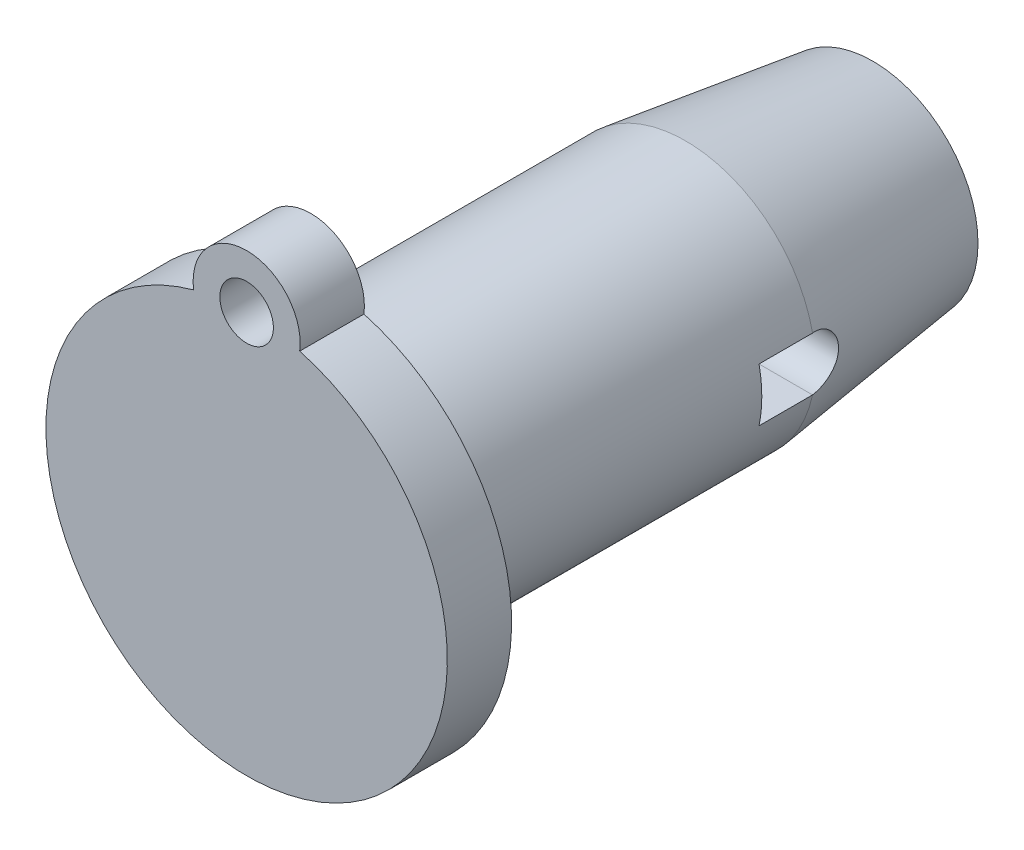
ISO-10303-21;
HEADER;
FILE_DESCRIPTION(('STEP AP214'),'2;1');
FILE_NAME('part.step','',(''),(''),'','','');
FILE_SCHEMA(('AUTOMOTIVE_DESIGN { 1 0 10303 214 1 1 1 1 }'));
ENDSEC;
DATA;
#1=APPLICATION_CONTEXT('core data for automotive mechanical design processes');
#2=APPLICATION_PROTOCOL_DEFINITION('international standard','automotive_design',2000,#1);
#3=PRODUCT_CONTEXT('',#1,'mechanical');
#4=PRODUCT('Part','Part','',(#3));
#5=PRODUCT_RELATED_PRODUCT_CATEGORY('part','',(#4));
#6=PRODUCT_DEFINITION_FORMATION('','',#4);
#7=PRODUCT_DEFINITION_CONTEXT('part definition',#1,'design');
#8=PRODUCT_DEFINITION('design','',#6,#7);
#9=PRODUCT_DEFINITION_SHAPE('','',#8);
#10=(LENGTH_UNIT() NAMED_UNIT(*) SI_UNIT(.MILLI.,.METRE.));
#11=(NAMED_UNIT(*) PLANE_ANGLE_UNIT() SI_UNIT($,.RADIAN.));
#12=(NAMED_UNIT(*) SI_UNIT($,.STERADIAN.) SOLID_ANGLE_UNIT());
#13=UNCERTAINTY_MEASURE_WITH_UNIT(LENGTH_MEASURE(1.E-05),#10,'distance_accuracy_value','');
#14=(GEOMETRIC_REPRESENTATION_CONTEXT(3) GLOBAL_UNCERTAINTY_ASSIGNED_CONTEXT((#13)) GLOBAL_UNIT_ASSIGNED_CONTEXT((#10,
#11,#12)) REPRESENTATION_CONTEXT('',''));
#15=CARTESIAN_POINT('',(0.,0.,0.));
#16=DIRECTION('',(0.,0.,1.));
#17=DIRECTION('',(1.,0.,0.));
#18=AXIS2_PLACEMENT_3D('',#15,#16,#17);
#19=CARTESIAN_POINT('',(0.,0.,0.));
#20=DIRECTION('',(0.,0.,1.));
#21=DIRECTION('',(1.,0.,0.));
#22=AXIS2_PLACEMENT_3D('',#19,#20,#21);
#23=PLANE('',#22);
#24=CARTESIAN_POINT('',(0.,37.5,0.));
#25=DIRECTION('',(0.,0.,-1.));
#26=DIRECTION('',(-1.,0.,0.));
#27=AXIS2_PLACEMENT_3D('',#24,#25,#26);
#28=CIRCLE('',#27,5.);
#29=CARTESIAN_POINT('',(-5.,37.5,0.));
#30=VERTEX_POINT('',#29);
#31=EDGE_CURVE('E102',#30,#30,#28,.T.);
#32=ORIENTED_EDGE('',*,*,#31,.F.);
#33=EDGE_LOOP('',(#32));
#34=FACE_BOUND('',#33,.T.);
#35=CARTESIAN_POINT('',(0.,0.,0.));
#36=DIRECTION('',(0.,0.,1.));
#37=DIRECTION('',(1.,0.,0.));
#38=AXIS2_PLACEMENT_3D('',#35,#36,#37);
#39=CIRCLE('',#38,37.5);
#40=CARTESIAN_POINT('',(-9.91071249821234,36.1666666666667,0.));
#41=VERTEX_POINT('',#40);
#42=CARTESIAN_POINT('',(9.91071249821234,36.1666666666667,0.));
#43=VERTEX_POINT('',#42);
#44=EDGE_CURVE('E48',#41,#43,#39,.T.);
#45=ORIENTED_EDGE('',*,*,#44,.F.);
#46=CARTESIAN_POINT('',(0.,37.5,0.));
#47=DIRECTION('',(0.,0.,-1.));
#48=DIRECTION('',(-1.,0.,0.));
#49=AXIS2_PLACEMENT_3D('',#46,#47,#48);
#50=CIRCLE('',#49,10.);
#51=EDGE_CURVE('E86',#41,#43,#50,.T.);
#52=ORIENTED_EDGE('',*,*,#51,.T.);
#53=EDGE_LOOP('',(#45,#52));
#54=FACE_BOUND('',#53,.T.);
#55=CARTESIAN_POINT('',(0.,0.,0.));
#56=DIRECTION('',(0.,0.,1.));
#57=DIRECTION('',(1.,0.,0.));
#58=AXIS2_PLACEMENT_3D('',#55,#56,#57);
#59=CIRCLE('',#58,24.25);
#60=CARTESIAN_POINT('',(24.25,0.,0.));
#61=VERTEX_POINT('',#60);
#62=EDGE_CURVE('E129',#61,#61,#59,.F.);
#63=ORIENTED_EDGE('',*,*,#62,.F.);
#64=EDGE_LOOP('',(#63));
#65=FACE_BOUND('',#64,.T.);
#66=ADVANCED_FACE('F32',(#34,#54,#65),#23,.F.);
#67=CARTESIAN_POINT('',(0.,0.,12.));
#68=DIRECTION('',(0.,0.,-1.));
#69=DIRECTION('',(-1.,0.,0.));
#70=AXIS2_PLACEMENT_3D('',#67,#68,#69);
#71=CYLINDRICAL_SURFACE('',#70,37.5);
#72=ORIENTED_EDGE('',*,*,#44,.T.);
#73=DIRECTION('',(0.,0.,-1.));
#74=VECTOR('',#73,1.);
#75=CARTESIAN_POINT('',(9.91071249821234,36.1666666666667,6.));
#76=LINE('',#75,#74);
#77=CARTESIAN_POINT('',(9.91071249821236,36.1666666666667,12.));
#78=VERTEX_POINT('',#77);
#79=EDGE_CURVE('E94',#43,#78,#76,.F.);
#80=ORIENTED_EDGE('',*,*,#79,.T.);
#81=CARTESIAN_POINT('',(0.,0.,12.));
#82=DIRECTION('',(0.,0.,1.));
#83=DIRECTION('',(1.,0.,0.));
#84=AXIS2_PLACEMENT_3D('',#81,#82,#83);
#85=CIRCLE('',#84,37.5);
#86=CARTESIAN_POINT('',(-9.91071249821236,36.1666666666667,12.));
#87=VERTEX_POINT('',#86);
#88=EDGE_CURVE('E53',#87,#78,#85,.T.);
#89=ORIENTED_EDGE('',*,*,#88,.F.);
#90=DIRECTION('',(0.,0.,-1.));
#91=VECTOR('',#90,1.);
#92=CARTESIAN_POINT('',(-9.91071249821234,36.1666666666667,6.));
#93=LINE('',#92,#91);
#94=EDGE_CURVE('E89',#87,#41,#93,.T.);
#95=ORIENTED_EDGE('',*,*,#94,.T.);
#96=EDGE_LOOP('',(#72,#80,#89,#95));
#97=FACE_BOUND('',#96,.T.);
#98=ADVANCED_FACE('F90',(#97),#71,.T.);
#99=CARTESIAN_POINT('',(0.,0.,12.));
#100=DIRECTION('',(0.,0.,1.));
#101=DIRECTION('',(1.,0.,0.));
#102=AXIS2_PLACEMENT_3D('',#99,#100,#101);
#103=PLANE('',#102);
#104=CARTESIAN_POINT('',(0.,37.5,12.));
#105=DIRECTION('',(0.,0.,-1.));
#106=DIRECTION('',(-1.,0.,0.));
#107=AXIS2_PLACEMENT_3D('',#104,#105,#106);
#108=CIRCLE('',#107,5.);
#109=CARTESIAN_POINT('',(-5.,37.5,12.));
#110=VERTEX_POINT('',#109);
#111=EDGE_CURVE('E98',#110,#110,#108,.T.);
#112=ORIENTED_EDGE('',*,*,#111,.T.);
#113=EDGE_LOOP('',(#112));
#114=FACE_BOUND('',#113,.T.);
#115=ORIENTED_EDGE('',*,*,#88,.T.);
#116=CARTESIAN_POINT('',(0.,37.5,12.));
#117=DIRECTION('',(0.,0.,-1.));
#118=DIRECTION('',(-1.,0.,0.));
#119=AXIS2_PLACEMENT_3D('',#116,#117,#118);
#120=CIRCLE('',#119,10.);
#121=EDGE_CURVE('E95',#87,#78,#120,.T.);
#122=ORIENTED_EDGE('',*,*,#121,.F.);
#123=EDGE_LOOP('',(#115,#122));
#124=FACE_BOUND('',#123,.T.);
#125=ADVANCED_FACE('F173',(#114,#124),#103,.T.);
#126=CARTESIAN_POINT('',(0.,0.,-105.));
#127=DIRECTION('',(0.,0.,1.));
#128=DIRECTION('',(1.,0.,0.));
#129=AXIS2_PLACEMENT_3D('',#126,#127,#128);
#130=CYLINDRICAL_SURFACE('',#129,24.25);
#131=CARTESIAN_POINT('',(0.,0.,-60.));
#132=DIRECTION('',(0.,0.,1.));
#133=DIRECTION('',(1.,0.,0.));
#134=AXIS2_PLACEMENT_3D('',#131,#132,#133);
#135=CIRCLE('',#134,24.25);
#136=CARTESIAN_POINT('',(23.7289380293346,-5.,-60.));
#137=VERTEX_POINT('',#136);
#138=CARTESIAN_POINT('',(23.7289380293346,5.,-60.));
#139=VERTEX_POINT('',#138);
#140=EDGE_CURVE('E11',#137,#139,#135,.T.);
#141=ORIENTED_EDGE('',*,*,#140,.T.);
#142=DIRECTION('',(0.,0.,1.));
#143=VECTOR('',#142,1.);
#144=CARTESIAN_POINT('',(23.7289380293346,5.,-105.));
#145=LINE('',#144,#143);
#146=CARTESIAN_POINT('',(23.7289380293344,5.,-70.));
#147=VERTEX_POINT('',#146);
#148=EDGE_CURVE('E124',#139,#147,#145,.F.);
#149=ORIENTED_EDGE('',*,*,#148,.T.);
#150=CARTESIAN_POINT('',(0.,0.,-69.9999999999988));
#151=DIRECTION('',(0.,0.,-1.));
#152=DIRECTION('',(-1.,0.,0.));
#153=AXIS2_PLACEMENT_3D('',#150,#151,#152);
#154=CIRCLE('',#153,24.25);
#155=CARTESIAN_POINT('',(-23.7289380293346,5.,-69.9999999999988));
#156=VERTEX_POINT('',#155);
#157=EDGE_CURVE('E136',#147,#156,#154,.F.);
#158=ORIENTED_EDGE('',*,*,#157,.T.);
#159=DIRECTION('',(0.,0.,1.));
#160=VECTOR('',#159,1.);
#161=CARTESIAN_POINT('',(-23.7289380293346,5.,-105.));
#162=LINE('',#161,#160);
#163=CARTESIAN_POINT('',(-23.7289380293346,5.,-60.));
#164=VERTEX_POINT('',#163);
#165=EDGE_CURVE('E87',#156,#164,#162,.T.);
#166=ORIENTED_EDGE('',*,*,#165,.T.);
#167=CARTESIAN_POINT('',(-23.7289380293346,-5.,-60.));
#168=VERTEX_POINT('',#167);
#169=EDGE_CURVE('E37',#164,#168,#135,.T.);
#170=ORIENTED_EDGE('',*,*,#169,.T.);
#171=DIRECTION('',(0.,0.,1.));
#172=VECTOR('',#171,1.);
#173=CARTESIAN_POINT('',(-23.7289380293346,-5.,-105.));
#174=LINE('',#173,#172);
#175=CARTESIAN_POINT('',(-23.7289380293344,-5.,-70.));
#176=VERTEX_POINT('',#175);
#177=EDGE_CURVE('E111',#168,#176,#174,.F.);
#178=ORIENTED_EDGE('',*,*,#177,.T.);
#179=CARTESIAN_POINT('',(23.7289380293346,-5.,-69.9999999999988));
#180=VERTEX_POINT('',#179);
#181=EDGE_CURVE('E137',#176,#180,#154,.F.);
#182=ORIENTED_EDGE('',*,*,#181,.T.);
#183=DIRECTION('',(0.,0.,1.));
#184=VECTOR('',#183,1.);
#185=CARTESIAN_POINT('',(23.7289380293346,-5.,-105.));
#186=LINE('',#185,#184);
#187=EDGE_CURVE('E121',#180,#137,#186,.T.);
#188=ORIENTED_EDGE('',*,*,#187,.T.);
#189=EDGE_LOOP('',(#141,#149,#158,#166,#170,#178,#182,#188));
#190=FACE_BOUND('',#189,.T.);
#191=ORIENTED_EDGE('',*,*,#62,.T.);
#192=EDGE_LOOP('',(#191));
#193=FACE_BOUND('',#192,.T.);
#194=ADVANCED_FACE('F169',(#190,#193),#130,.T.);
#195=CARTESIAN_POINT('',(0.,0.,-105.));
#196=DIRECTION('',(0.,0.,-1.));
#197=DIRECTION('',(-1.,0.,0.));
#198=AXIS2_PLACEMENT_3D('',#195,#196,#197);
#199=PLANE('',#198);
#200=CARTESIAN_POINT('',(0.,0.,-105.));
#201=DIRECTION('',(0.,0.,-1.));
#202=DIRECTION('',(-1.,0.,0.));
#203=AXIS2_PLACEMENT_3D('',#200,#201,#202);
#204=CIRCLE('',#203,19.6421625844411);
#205=CARTESIAN_POINT('',(-19.6421625844411,0.,-105.));
#206=VERTEX_POINT('',#205);
#207=EDGE_CURVE('E133',#206,#206,#204,.T.);
#208=ORIENTED_EDGE('',*,*,#207,.T.);
#209=EDGE_LOOP('',(#208));
#210=FACE_BOUND('',#209,.T.);
#211=ADVANCED_FACE('F166',(#210),#199,.T.);
#212=CARTESIAN_POINT('',(0.,0.,-105.));
#213=DIRECTION('',(0.,0.,1.));
#214=DIRECTION('',(1.,0.,0.));
#215=AXIS2_PLACEMENT_3D('',#212,#213,#214);
#216=CONICAL_SURFACE('',#215,19.6421625844411,0.130899693899571);
#217=CARTESIAN_POINT('',(23.7289649388656,-4.999999996,-69.9998));
#218=CARTESIAN_POINT('',(23.7104700631727,-5.00002168205824,-70.1371611527345));
#219=CARTESIAN_POINT('',(23.6931697108024,-4.9943510951462,-70.2746870216832));
#220=CARTESIAN_POINT('',(23.6610328182033,-4.97166071537804,-70.5490900063285));
#221=CARTESIAN_POINT('',(23.6461963073597,-4.95464078717558,-70.6859671142688));
#222=CARTESIAN_POINT('',(23.6190750840331,-4.90930842075368,-70.9579629389132));
#223=CARTESIAN_POINT('',(23.6067879816833,-4.881006631763,-71.0930831901091));
#224=CARTESIAN_POINT('',(23.5847348200625,-4.81326545476095,-71.3607074922254));
#225=CARTESIAN_POINT('',(23.5749686717502,-4.77382646022347,-71.4932116353951));
#226=CARTESIAN_POINT('',(23.5578743740245,-4.68402590239536,-71.7547151948179));
#227=CARTESIAN_POINT('',(23.5505476659769,-4.633657910529,-71.8837124978343));
#228=CARTESIAN_POINT('',(23.5381944165403,-4.52232813382929,-72.1372226618135));
#229=CARTESIAN_POINT('',(23.5331687311126,-4.46136241834712,-72.2617338381323));
#230=CARTESIAN_POINT('',(23.5252230719066,-4.32930990809895,-72.5052442460542));
#231=CARTESIAN_POINT('',(23.5223018849616,-4.25822897273691,-72.6242466161978));
#232=CARTESIAN_POINT('',(23.5183113219855,-4.10639024363207,-72.8560038678531));
#233=CARTESIAN_POINT('',(23.517242636218,-4.02562885481819,-72.9687564054627));
#234=CARTESIAN_POINT('',(23.516673865222,-3.8551213562726,-73.1870356749301));
#235=CARTESIAN_POINT('',(23.517171909464,-3.76538608441766,-73.2925708698536));
#236=CARTESIAN_POINT('',(23.5194231595377,-3.57744425862442,-73.4958636003331));
#237=CARTESIAN_POINT('',(23.5211768255456,-3.47923461049822,-73.5936182697841));
#238=CARTESIAN_POINT('',(23.5256162199151,-3.27506870871691,-73.7806197703362));
#239=CARTESIAN_POINT('',(23.5283018257197,-3.16911347510917,-73.869867718168));
#240=CARTESIAN_POINT('',(23.5342814611408,-2.95013592271356,-74.0392906953511));
#241=CARTESIAN_POINT('',(23.5375757166737,-2.83711099015972,-74.1194623379156));
#242=CARTESIAN_POINT('',(23.5444955444492,-2.60347755994222,-74.2710083709112));
#243=CARTESIAN_POINT('',(23.548124470236,-2.48279720740705,-74.3422718604396));
#244=CARTESIAN_POINT('',(23.5553761274531,-2.23583659597056,-74.4744449339692));
#245=CARTESIAN_POINT('',(23.5589988560845,-2.10955427528224,-74.5353506652907));
#246=CARTESIAN_POINT('',(23.5659590347692,-1.85237030960426,-74.646324213992));
#247=CARTESIAN_POINT('',(23.5692966078109,-1.72147069083953,-74.6963967181998));
#248=CARTESIAN_POINT('',(23.5754529813841,-1.45587507118221,-74.7854002588963));
#249=CARTESIAN_POINT('',(23.5782715910643,-1.32117769456142,-74.8243271994603));
#250=CARTESIAN_POINT('',(23.5832053231617,-1.04850432464677,-74.8908468723119));
#251=CARTESIAN_POINT('',(23.5853180437889,-0.910518815351349,-74.9184009818406));
#252=CARTESIAN_POINT('',(23.5886928174078,-0.632712195443342,-74.9618033723962));
#253=CARTESIAN_POINT('',(23.5899545729509,-0.49289046038367,-74.9776475604925));
#254=CARTESIAN_POINT('',(23.5923143506583,-0.0721543310541742,-75.0073508302966));
#255=CARTESIAN_POINT('',(23.5919925669189,0.210323661298461,-75.0034518304731));
#256=CARTESIAN_POINT('',(23.5887316515117,0.629641129797249,-74.9621915763884));
#257=CARTESIAN_POINT('',(23.5871846192471,0.768541371999777,-74.9425740735595));
#258=CARTESIAN_POINT('',(23.5832832282829,1.04419794943228,-74.8917523490391));
#259=CARTESIAN_POINT('',(23.5809291498092,1.18095501161279,-74.8605521488262));
#260=CARTESIAN_POINT('',(23.5755637064913,1.45138923641656,-74.7867668452828));
#261=CARTESIAN_POINT('',(23.5725520982712,1.5850652383171,-74.7441775251027));
#262=CARTESIAN_POINT('',(23.5660809030568,1.84831323166076,-74.6479421657887));
#263=CARTESIAN_POINT('',(23.5626214793859,1.97788669800615,-74.5943001534956));
#264=CARTESIAN_POINT('',(23.5554971317746,2.23231843618939,-74.4762110124275));
#265=CARTESIAN_POINT('',(23.5518318141297,2.357166853702,-74.4117426790338));
#266=CARTESIAN_POINT('',(23.5445923079358,2.6009544979263,-74.2725553735148));
#267=CARTESIAN_POINT('',(23.5410180863066,2.71989588502545,-74.1978401871574));
#268=CARTESIAN_POINT('',(23.534274262882,2.95112444776937,-74.0386352961893));
#269=CARTESIAN_POINT('',(23.5311048120468,3.06340913246564,-73.9541419670622));
#270=CARTESIAN_POINT('',(23.5255069399752,3.2804414699541,-73.7760300579979));
#271=CARTESIAN_POINT('',(23.5230782417502,3.38519192878335,-73.6824149062897));
#272=CARTESIAN_POINT('',(23.5192968668805,3.58660778043964,-73.4865465846002));
#273=CARTESIAN_POINT('',(23.517945806547,3.68326083467848,-73.3842806928026));
#274=CARTESIAN_POINT('',(23.5166608885635,3.86757620445604,-73.172003316562));
#275=CARTESIAN_POINT('',(23.5167264923411,3.95524192397002,-73.0619947914846));
#276=CARTESIAN_POINT('',(23.518589772497,4.12103284180031,-72.8349354194562));
#277=CARTESIAN_POINT('',(23.5203883334005,4.19915314505917,-72.717881004792));
#278=CARTESIAN_POINT('',(23.5260023303429,4.34520613376912,-72.4776867714588));
#279=CARTESIAN_POINT('',(23.5298169845251,4.41314275543041,-72.3545493286057));
#280=CARTESIAN_POINT('',(23.539658991676,4.5378209538831,-72.1041780923405));
#281=CARTESIAN_POINT('',(23.5456664594724,4.59465630344935,-71.9769902071136));
#282=CARTESIAN_POINT('',(23.5600757173546,4.69746256782489,-71.7184836306375));
#283=CARTESIAN_POINT('',(23.5684765861761,4.74343765052096,-71.5871665460624));
#284=CARTESIAN_POINT('',(23.5877837018354,4.82421732486408,-71.3214376350166));
#285=CARTESIAN_POINT('',(23.598687946663,4.85903078969404,-71.1870283583217));
#286=CARTESIAN_POINT('',(23.6230510510441,4.91732036610784,-70.9160546366809));
#287=CARTESIAN_POINT('',(23.6365088142544,4.94080132798224,-70.779491139628));
#288=CARTESIAN_POINT('',(23.6626960584569,4.97240041263357,-70.5355634238806));
#289=CARTESIAN_POINT('',(23.674926711635,4.98276925616715,-70.4284309250591));
#290=CARTESIAN_POINT('',(23.7008547784321,4.99656697003634,-70.2141019408527));
#291=CARTESIAN_POINT('',(23.7145493897121,5.00000885817916,-70.106905954906));
#292=CARTESIAN_POINT('',(23.7289649388656,4.999999996,-69.9998));
#293=B_SPLINE_CURVE_WITH_KNOTS('',3,(#217,#218,#219,#220,#221,#222,#223,#224,#225,#226,#227,
#228,#229,#230,#231,#232,#233,#234,#235,#236,#237,#238,#239,#240,#241,#242,#243,#244,#245,#246,
#247,#248,#249,#250,#251,#252,#253,#254,#255,#256,#257,#258,#259,#260,#261,#262,#263,#264,#265,
#266,#267,#268,#269,#270,#271,#272,#273,#274,#275,#276,#277,#278,#279,#280,#281,#282,#283,#284,
#285,#286,#287,#288,#289,#290,#291,#292),.UNSPECIFIED.,.F.,.F.,(4,2,2,2,2,2,2,2,2,2,2,2,2,2,2,2,
2,2,2,2,2,2,2,2,2,2,2,2,2,2,2,2,2,2,2,2,2,4),(0.,0.415686055470123,0.831377068284588,
1.2466766256498,1.66196151245071,2.07749134054303,2.4931756169336,2.90862007433357,
3.3242192979287,3.7393225232142,4.15457795872217,4.56977880574593,4.98513407616201,
5.40523194507366,5.82548573374811,6.24555734093077,6.66578312423467,7.08742450267818,
7.50921318645035,8.35189766250098,8.7723857355981,9.19272795279982,9.61322601874084,
10.0335711541504,10.4547493977957,10.8757724514425,11.2969520708574,11.7179740056037,
12.1396262351341,12.5611181681951,12.9828253505677,13.4043691114731,13.8221814678777,
14.2398332173575,14.6571521170104,15.0742922461924,15.3990458657487,15.7231886047225),.UNSPECIFIED.);
#294=EDGE_CURVE('E145',#180,#147,#293,.T.);
#295=ORIENTED_EDGE('',*,*,#294,.F.);
#296=ORIENTED_EDGE('',*,*,#181,.F.);
#297=CARTESIAN_POINT('',(-23.7289649388656,4.999999996,-69.9998));
#298=CARTESIAN_POINT('',(-23.7104700631727,5.00002168205824,-70.1371611527345));
#299=CARTESIAN_POINT('',(-23.6931697108024,4.9943510951462,-70.2746870216832));
#300=CARTESIAN_POINT('',(-23.6610328182033,4.97166071537804,-70.5490900063285));
#301=CARTESIAN_POINT('',(-23.6461963073597,4.95464078717558,-70.6859671142688));
#302=CARTESIAN_POINT('',(-23.6190750840331,4.90930842075368,-70.9579629389132));
#303=CARTESIAN_POINT('',(-23.6067879816833,4.881006631763,-71.0930831901091));
#304=CARTESIAN_POINT('',(-23.5847348200625,4.81326545476095,-71.3607074922254));
#305=CARTESIAN_POINT('',(-23.5749686717502,4.77382646022347,-71.4932116353951));
#306=CARTESIAN_POINT('',(-23.5578743740245,4.68402590239536,-71.7547151948179));
#307=CARTESIAN_POINT('',(-23.5505476659769,4.633657910529,-71.8837124978343));
#308=CARTESIAN_POINT('',(-23.5381944165403,4.52232813382929,-72.1372226618135));
#309=CARTESIAN_POINT('',(-23.5331687311126,4.46136241834712,-72.2617338381323));
#310=CARTESIAN_POINT('',(-23.5252230719066,4.32930990809895,-72.5052442460542));
#311=CARTESIAN_POINT('',(-23.5223018849616,4.25822897273691,-72.6242466161978));
#312=CARTESIAN_POINT('',(-23.5183113219855,4.10639024363207,-72.8560038678531));
#313=CARTESIAN_POINT('',(-23.517242636218,4.02562885481819,-72.9687564054627));
#314=CARTESIAN_POINT('',(-23.516673865222,3.8551213562726,-73.1870356749301));
#315=CARTESIAN_POINT('',(-23.517171909464,3.76538608441766,-73.2925708698536));
#316=CARTESIAN_POINT('',(-23.5194231595377,3.57744425862442,-73.4958636003331));
#317=CARTESIAN_POINT('',(-23.5211768255456,3.47923461049822,-73.5936182697841));
#318=CARTESIAN_POINT('',(-23.5256162199151,3.27506870871691,-73.7806197703362));
#319=CARTESIAN_POINT('',(-23.5283018257197,3.16911347510917,-73.869867718168));
#320=CARTESIAN_POINT('',(-23.5342814611408,2.95013592271356,-74.0392906953511));
#321=CARTESIAN_POINT('',(-23.5375757166737,2.83711099015972,-74.1194623379156));
#322=CARTESIAN_POINT('',(-23.5444955444492,2.60347755994222,-74.2710083709112));
#323=CARTESIAN_POINT('',(-23.548124470236,2.48279720740705,-74.3422718604396));
#324=CARTESIAN_POINT('',(-23.5553761274531,2.23583659597056,-74.4744449339692));
#325=CARTESIAN_POINT('',(-23.5589988560845,2.10955427528224,-74.5353506652907));
#326=CARTESIAN_POINT('',(-23.5659590347692,1.85237030960426,-74.646324213992));
#327=CARTESIAN_POINT('',(-23.5692966078109,1.72147069083953,-74.6963967181998));
#328=CARTESIAN_POINT('',(-23.5754529813841,1.45587507118221,-74.7854002588963));
#329=CARTESIAN_POINT('',(-23.5782715910643,1.32117769456142,-74.8243271994603));
#330=CARTESIAN_POINT('',(-23.5832053231617,1.04850432464677,-74.8908468723119));
#331=CARTESIAN_POINT('',(-23.5853180437889,0.910518815351349,-74.9184009818406));
#332=CARTESIAN_POINT('',(-23.5886928174078,0.632712195443342,-74.9618033723962));
#333=CARTESIAN_POINT('',(-23.5899545729509,0.49289046038367,-74.9776475604925));
#334=CARTESIAN_POINT('',(-23.5923143506583,0.0721543310541742,-75.0073508302966));
#335=CARTESIAN_POINT('',(-23.5919925669189,-0.210323661298461,-75.0034518304731));
#336=CARTESIAN_POINT('',(-23.5887316515117,-0.629641129797249,-74.9621915763884));
#337=CARTESIAN_POINT('',(-23.5871846192471,-0.768541371999777,-74.9425740735595));
#338=CARTESIAN_POINT('',(-23.5832832282829,-1.04419794943228,-74.8917523490391));
#339=CARTESIAN_POINT('',(-23.5809291498092,-1.18095501161279,-74.8605521488262));
#340=CARTESIAN_POINT('',(-23.5755637064913,-1.45138923641656,-74.7867668452828));
#341=CARTESIAN_POINT('',(-23.5725520982712,-1.5850652383171,-74.7441775251027));
#342=CARTESIAN_POINT('',(-23.5660809030568,-1.84831323166076,-74.6479421657887));
#343=CARTESIAN_POINT('',(-23.5626214793859,-1.97788669800615,-74.5943001534956));
#344=CARTESIAN_POINT('',(-23.5554971317746,-2.23231843618939,-74.4762110124275));
#345=CARTESIAN_POINT('',(-23.5518318141297,-2.357166853702,-74.4117426790338));
#346=CARTESIAN_POINT('',(-23.5445923079358,-2.6009544979263,-74.2725553735148));
#347=CARTESIAN_POINT('',(-23.5410180863066,-2.71989588502545,-74.1978401871574));
#348=CARTESIAN_POINT('',(-23.534274262882,-2.95112444776937,-74.0386352961893));
#349=CARTESIAN_POINT('',(-23.5311048120468,-3.06340913246564,-73.9541419670622));
#350=CARTESIAN_POINT('',(-23.5255069399752,-3.2804414699541,-73.7760300579979));
#351=CARTESIAN_POINT('',(-23.5230782417502,-3.38519192878335,-73.6824149062897));
#352=CARTESIAN_POINT('',(-23.5192968668805,-3.58660778043964,-73.4865465846002));
#353=CARTESIAN_POINT('',(-23.517945806547,-3.68326083467848,-73.3842806928026));
#354=CARTESIAN_POINT('',(-23.5166608885635,-3.86757620445604,-73.172003316562));
#355=CARTESIAN_POINT('',(-23.5167264923411,-3.95524192397002,-73.0619947914846));
#356=CARTESIAN_POINT('',(-23.518589772497,-4.12103284180031,-72.8349354194562));
#357=CARTESIAN_POINT('',(-23.5203883334005,-4.19915314505917,-72.717881004792));
#358=CARTESIAN_POINT('',(-23.5260023303429,-4.34520613376912,-72.4776867714588));
#359=CARTESIAN_POINT('',(-23.5298169845251,-4.41314275543041,-72.3545493286057));
#360=CARTESIAN_POINT('',(-23.539658991676,-4.5378209538831,-72.1041780923405));
#361=CARTESIAN_POINT('',(-23.5456664594724,-4.59465630344935,-71.9769902071136));
#362=CARTESIAN_POINT('',(-23.5600757173546,-4.69746256782489,-71.7184836306375));
#363=CARTESIAN_POINT('',(-23.5684765861761,-4.74343765052096,-71.5871665460624));
#364=CARTESIAN_POINT('',(-23.5877837018354,-4.82421732486408,-71.3214376350166));
#365=CARTESIAN_POINT('',(-23.598687946663,-4.85903078969404,-71.1870283583217));
#366=CARTESIAN_POINT('',(-23.6230510510441,-4.91732036610784,-70.9160546366809));
#367=CARTESIAN_POINT('',(-23.6365088142544,-4.94080132798224,-70.779491139628));
#368=CARTESIAN_POINT('',(-23.6626960584569,-4.97240041263357,-70.5355634238806));
#369=CARTESIAN_POINT('',(-23.674926711635,-4.98276925616715,-70.4284309250591));
#370=CARTESIAN_POINT('',(-23.7008547784321,-4.99656697003634,-70.2141019408527));
#371=CARTESIAN_POINT('',(-23.7145493897121,-5.00000885817916,-70.106905954906));
#372=CARTESIAN_POINT('',(-23.7289649388656,-4.999999996,-69.9998));
#373=B_SPLINE_CURVE_WITH_KNOTS('',3,(#297,#298,#299,#300,#301,#302,#303,#304,#305,#306,#307,
#308,#309,#310,#311,#312,#313,#314,#315,#316,#317,#318,#319,#320,#321,#322,#323,#324,#325,#326,
#327,#328,#329,#330,#331,#332,#333,#334,#335,#336,#337,#338,#339,#340,#341,#342,#343,#344,#345,
#346,#347,#348,#349,#350,#351,#352,#353,#354,#355,#356,#357,#358,#359,#360,#361,#362,#363,#364,
#365,#366,#367,#368,#369,#370,#371,#372),.UNSPECIFIED.,.F.,.F.,(4,2,2,2,2,2,2,2,2,2,2,2,2,2,2,2,
2,2,2,2,2,2,2,2,2,2,2,2,2,2,2,2,2,2,2,2,2,4),(0.,0.415686055470123,0.831377068284588,
1.2466766256498,1.66196151245071,2.07749134054303,2.4931756169336,2.90862007433357,
3.3242192979287,3.7393225232142,4.15457795872217,4.56977880574593,4.98513407616201,
5.40523194507366,5.82548573374811,6.24555734093077,6.66578312423467,7.08742450267818,
7.50921318645035,8.35189766250098,8.7723857355981,9.19272795279982,9.61322601874084,
10.0335711541504,10.4547493977957,10.8757724514425,11.2969520708574,11.7179740056037,
12.1396262351341,12.5611181681951,12.9828253505677,13.4043691114731,13.8221814678777,
14.2398332173575,14.6571521170104,15.0742922461924,15.3990458657487,15.7231886047225),.UNSPECIFIED.);
#374=EDGE_CURVE('E140',#156,#176,#373,.T.);
#375=ORIENTED_EDGE('',*,*,#374,.F.);
#376=ORIENTED_EDGE('',*,*,#157,.F.);
#377=EDGE_LOOP('',(#295,#296,#375,#376));
#378=FACE_BOUND('',#377,.T.);
#379=ORIENTED_EDGE('',*,*,#207,.F.);
#380=EDGE_LOOP('',(#379));
#381=FACE_BOUND('',#380,.T.);
#382=ADVANCED_FACE('F34',(#378,#381),#216,.T.);
#383=CARTESIAN_POINT('',(-37.5,5.,-60.));
#384=DIRECTION('',(0.,0.,1.));
#385=DIRECTION('',(1.,0.,0.));
#386=AXIS2_PLACEMENT_3D('',#383,#384,#385);
#387=PLANE('',#386);
#388=DIRECTION('',(1.,0.,0.));
#389=VECTOR('',#388,1.);
#390=CARTESIAN_POINT('',(-37.5,5.,-60.));
#391=LINE('',#390,#389);
#392=EDGE_CURVE('E108',#164,#139,#391,.T.);
#393=ORIENTED_EDGE('',*,*,#392,.T.);
#394=ORIENTED_EDGE('',*,*,#140,.F.);
#395=DIRECTION('',(1.,0.,0.));
#396=VECTOR('',#395,1.);
#397=CARTESIAN_POINT('',(-37.5,-5.,-60.));
#398=LINE('',#397,#396);
#399=EDGE_CURVE('E107',#168,#137,#398,.T.);
#400=ORIENTED_EDGE('',*,*,#399,.F.);
#401=ORIENTED_EDGE('',*,*,#169,.F.);
#402=EDGE_LOOP('',(#393,#394,#400,#401));
#403=FACE_BOUND('',#402,.T.);
#404=ADVANCED_FACE('F162',(#403),#387,.F.);
#405=CARTESIAN_POINT('',(-37.5,5.,-60.));
#406=DIRECTION('',(0.,1.,0.));
#407=DIRECTION('',(0.,0.,1.));
#408=AXIS2_PLACEMENT_3D('',#405,#406,#407);
#409=PLANE('',#408);
#410=DIRECTION('',(1.,0.,0.));
#411=VECTOR('',#410,1.);
#412=CARTESIAN_POINT('',(-37.5,5.,-70.));
#413=LINE('',#412,#411);
#414=EDGE_CURVE('E112',#156,#147,#413,.T.);
#415=ORIENTED_EDGE('',*,*,#414,.T.);
#416=ORIENTED_EDGE('',*,*,#148,.F.);
#417=ORIENTED_EDGE('',*,*,#392,.F.);
#418=ORIENTED_EDGE('',*,*,#165,.F.);
#419=EDGE_LOOP('',(#415,#416,#417,#418));
#420=FACE_BOUND('',#419,.T.);
#421=ADVANCED_FACE('F156',(#420),#409,.F.);
#422=CARTESIAN_POINT('',(-37.5,-5.,-60.));
#423=DIRECTION('',(0.,-1.,0.));
#424=DIRECTION('',(0.,0.,-1.));
#425=AXIS2_PLACEMENT_3D('',#422,#423,#424);
#426=PLANE('',#425);
#427=DIRECTION('',(1.,0.,0.));
#428=VECTOR('',#427,1.);
#429=CARTESIAN_POINT('',(-37.5,-5.,-70.));
#430=LINE('',#429,#428);
#431=EDGE_CURVE('E115',#176,#180,#430,.T.);
#432=ORIENTED_EDGE('',*,*,#431,.F.);
#433=ORIENTED_EDGE('',*,*,#177,.F.);
#434=ORIENTED_EDGE('',*,*,#399,.T.);
#435=ORIENTED_EDGE('',*,*,#187,.F.);
#436=EDGE_LOOP('',(#432,#433,#434,#435));
#437=FACE_BOUND('',#436,.T.);
#438=ADVANCED_FACE('F154',(#437),#426,.F.);
#439=CARTESIAN_POINT('',(-37.5,0.,-70.));
#440=DIRECTION('',(1.,0.,0.));
#441=DIRECTION('',(0.,0.,-1.));
#442=AXIS2_PLACEMENT_3D('',#439,#440,#441);
#443=CYLINDRICAL_SURFACE('',#442,5.);
#444=ORIENTED_EDGE('',*,*,#294,.T.);
#445=ORIENTED_EDGE('',*,*,#414,.F.);
#446=ORIENTED_EDGE('',*,*,#374,.T.);
#447=ORIENTED_EDGE('',*,*,#431,.T.);
#448=EDGE_LOOP('',(#444,#445,#446,#447));
#449=FACE_BOUND('',#448,.T.);
#450=ADVANCED_FACE('F149',(#449),#443,.F.);
#451=CARTESIAN_POINT('',(0.,37.5,12.));
#452=DIRECTION('',(0.,0.,-1.));
#453=DIRECTION('',(-1.,0.,0.));
#454=AXIS2_PLACEMENT_3D('',#451,#452,#453);
#455=CYLINDRICAL_SURFACE('',#454,10.);
#456=ORIENTED_EDGE('',*,*,#79,.F.);
#457=ORIENTED_EDGE('',*,*,#51,.F.);
#458=ORIENTED_EDGE('',*,*,#94,.F.);
#459=ORIENTED_EDGE('',*,*,#121,.T.);
#460=EDGE_LOOP('',(#456,#457,#458,#459));
#461=FACE_BOUND('',#460,.T.);
#462=ADVANCED_FACE('F97',(#461),#455,.T.);
#463=CARTESIAN_POINT('',(0.,37.5,12.));
#464=DIRECTION('',(0.,0.,-1.));
#465=DIRECTION('',(-1.,0.,0.));
#466=AXIS2_PLACEMENT_3D('',#463,#464,#465);
#467=CYLINDRICAL_SURFACE('',#466,5.);
#468=ORIENTED_EDGE('',*,*,#111,.F.);
#469=EDGE_LOOP('',(#468));
#470=FACE_BOUND('',#469,.T.);
#471=ORIENTED_EDGE('',*,*,#31,.T.);
#472=EDGE_LOOP('',(#471));
#473=FACE_BOUND('',#472,.T.);
#474=ADVANCED_FACE('F228',(#470,#473),#467,.F.);
#475=CLOSED_SHELL('',(#66,#98,#125,#194,#211,#382,#404,#421,#438,#450,#462,#474));
#476=MANIFOLD_SOLID_BREP('B2',#475);
#477=ADVANCED_BREP_SHAPE_REPRESENTATION('',(#18,#476),#14);
#478=SHAPE_DEFINITION_REPRESENTATION(#9,#477);
ENDSEC;
END-ISO-10303-21;
